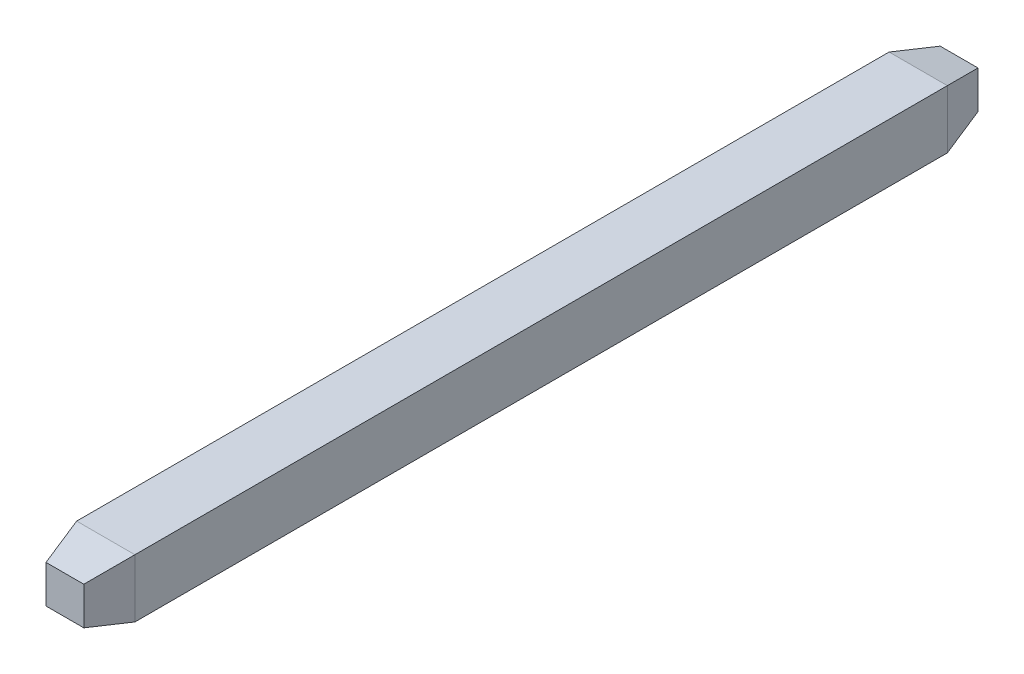
ISO-10303-21;
HEADER;
FILE_DESCRIPTION(('STEP AP214'),'2;1');
FILE_NAME('part.step','',(''),(''),'','','');
FILE_SCHEMA(('AUTOMOTIVE_DESIGN { 1 0 10303 214 1 1 1 1 }'));
ENDSEC;
DATA;
#1=APPLICATION_CONTEXT('core data for automotive mechanical design processes');
#2=APPLICATION_PROTOCOL_DEFINITION('international standard','automotive_design',2000,#1);
#3=PRODUCT_CONTEXT('',#1,'mechanical');
#4=PRODUCT('Part','Part','',(#3));
#5=PRODUCT_RELATED_PRODUCT_CATEGORY('part','',(#4));
#6=PRODUCT_DEFINITION_FORMATION('','',#4);
#7=PRODUCT_DEFINITION_CONTEXT('part definition',#1,'design');
#8=PRODUCT_DEFINITION('design','',#6,#7);
#9=PRODUCT_DEFINITION_SHAPE('','',#8);
#10=(LENGTH_UNIT() NAMED_UNIT(*) SI_UNIT(.MILLI.,.METRE.));
#11=(NAMED_UNIT(*) PLANE_ANGLE_UNIT() SI_UNIT($,.RADIAN.));
#12=(NAMED_UNIT(*) SI_UNIT($,.STERADIAN.) SOLID_ANGLE_UNIT());
#13=UNCERTAINTY_MEASURE_WITH_UNIT(LENGTH_MEASURE(1.E-05),#10,'distance_accuracy_value','');
#14=(GEOMETRIC_REPRESENTATION_CONTEXT(3) GLOBAL_UNCERTAINTY_ASSIGNED_CONTEXT((#13)) GLOBAL_UNIT_ASSIGNED_CONTEXT((#10,
#11,#12)) REPRESENTATION_CONTEXT('',''));
#15=CARTESIAN_POINT('',(0.,0.,0.));
#16=DIRECTION('',(0.,0.,1.));
#17=DIRECTION('',(1.,0.,0.));
#18=AXIS2_PLACEMENT_3D('',#15,#16,#17);
#19=CARTESIAN_POINT('',(0.47,0.,13.5));
#20=DIRECTION('',(0.970142500145391,0.,0.242535625036098));
#21=DIRECTION('',(0.242535625036098,0.,-0.970142500145391));
#22=AXIS2_PLACEMENT_3D('',#19,#20,#21);
#23=PLANE('',#22);
#24=DIRECTION('',(0.,-1.,0.));
#25=VECTOR('',#24,1.);
#26=CARTESIAN_POINT('',(0.37,0.,13.9));
#27=LINE('',#26,#25);
#28=CARTESIAN_POINT('',(0.370000000000048,-0.370000000000024,13.9));
#29=VERTEX_POINT('',#28);
#30=CARTESIAN_POINT('',(0.370000000000024,0.370000000000024,13.9));
#31=VERTEX_POINT('',#30);
#32=EDGE_CURVE('E20',#29,#31,#27,.F.);
#33=ORIENTED_EDGE('',*,*,#32,.F.);
#34=DIRECTION('',(-0.235702260395516,0.235702260395287,0.942809041582121));
#35=VECTOR('',#34,1.);
#36=CARTESIAN_POINT('',(0.57,-0.569999999999903,13.1));
#37=LINE('',#36,#35);
#38=CARTESIAN_POINT('',(0.569999999999951,-0.569999999999976,13.1));
#39=VERTEX_POINT('',#38);
#40=EDGE_CURVE('E110',#39,#29,#37,.T.);
#41=ORIENTED_EDGE('',*,*,#40,.F.);
#42=DIRECTION('',(0.,1.,0.));
#43=VECTOR('',#42,1.);
#44=CARTESIAN_POINT('',(0.57,0.,13.1));
#45=LINE('',#44,#43);
#46=CARTESIAN_POINT('',(0.569999999999951,0.569999999999976,13.1));
#47=VERTEX_POINT('',#46);
#48=EDGE_CURVE('E96',#47,#39,#45,.F.);
#49=ORIENTED_EDGE('',*,*,#48,.F.);
#50=DIRECTION('',(0.235702260395516,0.235702260395287,-0.942809041582121));
#51=VECTOR('',#50,1.);
#52=CARTESIAN_POINT('',(0.37,0.370000000000097,13.9));
#53=LINE('',#52,#51);
#54=EDGE_CURVE('E94',#31,#47,#53,.T.);
#55=ORIENTED_EDGE('',*,*,#54,.F.);
#56=EDGE_LOOP('',(#33,#41,#49,#55));
#57=FACE_BOUND('',#56,.T.);
#58=ADVANCED_FACE('F17',(#57),#23,.T.);
#59=CARTESIAN_POINT('',(0.47,0.,-3.2));
#60=DIRECTION('',(0.970142500145391,0.,-0.242535625036098));
#61=DIRECTION('',(-0.242535625036098,0.,-0.970142500145391));
#62=AXIS2_PLACEMENT_3D('',#59,#60,#61);
#63=PLANE('',#62);
#64=DIRECTION('',(0.,1.,0.));
#65=VECTOR('',#64,1.);
#66=CARTESIAN_POINT('',(0.37,0.,-3.6));
#67=LINE('',#66,#65);
#68=CARTESIAN_POINT('',(0.370000000000024,-0.370000000000024,-3.60000000000001));
#69=VERTEX_POINT('',#68);
#70=CARTESIAN_POINT('',(0.370000000000049,0.370000000000024,-3.60000000000002));
#71=VERTEX_POINT('',#70);
#72=EDGE_CURVE('E79',#69,#71,#67,.T.);
#73=ORIENTED_EDGE('',*,*,#72,.T.);
#74=DIRECTION('',(-0.235702260395516,-0.235702260395287,-0.942809041582121));
#75=VECTOR('',#74,1.);
#76=CARTESIAN_POINT('',(0.57,0.569999999999903,-2.79999999999998));
#77=LINE('',#76,#75);
#78=CARTESIAN_POINT('',(0.569999999999952,0.569999999999988,-2.79999999999998));
#79=VERTEX_POINT('',#78);
#80=EDGE_CURVE('E99',#79,#71,#77,.T.);
#81=ORIENTED_EDGE('',*,*,#80,.F.);
#82=DIRECTION('',(0.,1.,0.));
#83=VECTOR('',#82,1.);
#84=CARTESIAN_POINT('',(0.57,0.,-2.8));
#85=LINE('',#84,#83);
#86=CARTESIAN_POINT('',(0.569999999999952,-0.569999999999976,-2.79999999999998));
#87=VERTEX_POINT('',#86);
#88=EDGE_CURVE('E119',#87,#79,#85,.T.);
#89=ORIENTED_EDGE('',*,*,#88,.F.);
#90=DIRECTION('',(0.235702260395516,-0.235702260395287,0.942809041582121));
#91=VECTOR('',#90,1.);
#92=CARTESIAN_POINT('',(0.37,-0.370000000000097,-3.60000000000002));
#93=LINE('',#92,#91);
#94=EDGE_CURVE('E116',#69,#87,#93,.T.);
#95=ORIENTED_EDGE('',*,*,#94,.F.);
#96=EDGE_LOOP('',(#73,#81,#89,#95));
#97=FACE_BOUND('',#96,.T.);
#98=ADVANCED_FACE('F298',(#97),#63,.T.);
#99=CARTESIAN_POINT('',(0.,0.,13.9));
#100=DIRECTION('',(0.,0.,1.));
#101=DIRECTION('',(0.,-1.,0.));
#102=AXIS2_PLACEMENT_3D('',#99,#100,#101);
#103=PLANE('',#102);
#104=ORIENTED_EDGE('',*,*,#32,.T.);
#105=DIRECTION('',(1.,0.,0.));
#106=VECTOR('',#105,1.);
#107=CARTESIAN_POINT('',(0.,0.370000000000097,13.9));
#108=LINE('',#107,#106);
#109=CARTESIAN_POINT('',(-0.370000000000024,0.370000000000024,13.9));
#110=VERTEX_POINT('',#109);
#111=EDGE_CURVE('E88',#110,#31,#108,.T.);
#112=ORIENTED_EDGE('',*,*,#111,.F.);
#113=DIRECTION('',(0.,1.,0.));
#114=VECTOR('',#113,1.);
#115=CARTESIAN_POINT('',(-0.370000000000097,0.,13.9));
#116=LINE('',#115,#114);
#117=CARTESIAN_POINT('',(-0.370000000000024,-0.370000000000048,13.9));
#118=VERTEX_POINT('',#117);
#119=EDGE_CURVE('E125',#118,#110,#116,.T.);
#120=ORIENTED_EDGE('',*,*,#119,.F.);
#121=DIRECTION('',(1.,0.,0.));
#122=VECTOR('',#121,1.);
#123=CARTESIAN_POINT('',(0.,-0.370000000000097,13.9));
#124=LINE('',#123,#122);
#125=EDGE_CURVE('E90',#29,#118,#124,.F.);
#126=ORIENTED_EDGE('',*,*,#125,.F.);
#127=EDGE_LOOP('',(#104,#112,#120,#126));
#128=FACE_BOUND('',#127,.T.);
#129=ADVANCED_FACE('F85',(#128),#103,.T.);
#130=CARTESIAN_POINT('',(0.,0.47,13.5));
#131=DIRECTION('',(0.,0.970142500145391,0.242535625036098));
#132=DIRECTION('',(0.,-0.242535625036098,0.970142500145391));
#133=AXIS2_PLACEMENT_3D('',#130,#131,#132);
#134=PLANE('',#133);
#135=ORIENTED_EDGE('',*,*,#111,.T.);
#136=ORIENTED_EDGE('',*,*,#54,.T.);
#137=DIRECTION('',(-1.,0.,0.));
#138=VECTOR('',#137,1.);
#139=CARTESIAN_POINT('',(0.,0.57,13.1));
#140=LINE('',#139,#138);
#141=CARTESIAN_POINT('',(-0.569999999999976,0.569999999999951,13.1));
#142=VERTEX_POINT('',#141);
#143=EDGE_CURVE('E128',#142,#47,#140,.F.);
#144=ORIENTED_EDGE('',*,*,#143,.F.);
#145=DIRECTION('',(-0.235702260395287,0.235702260395516,-0.942809041582121));
#146=VECTOR('',#145,1.);
#147=CARTESIAN_POINT('',(-0.370000000000097,0.37,13.9));
#148=LINE('',#147,#146);
#149=EDGE_CURVE('E103',#110,#142,#148,.T.);
#150=ORIENTED_EDGE('',*,*,#149,.F.);
#151=EDGE_LOOP('',(#135,#136,#144,#150));
#152=FACE_BOUND('',#151,.T.);
#153=ADVANCED_FACE('F101',(#152),#134,.T.);
#154=CARTESIAN_POINT('',(0.,0.47,-3.2));
#155=DIRECTION('',(0.,0.970142500145391,-0.242535625036098));
#156=DIRECTION('',(0.,0.242535625036098,0.970142500145391));
#157=AXIS2_PLACEMENT_3D('',#154,#155,#156);
#158=PLANE('',#157);
#159=DIRECTION('',(1.,0.,0.));
#160=VECTOR('',#159,1.);
#161=CARTESIAN_POINT('',(0.,0.37,-3.6));
#162=LINE('',#161,#160);
#163=CARTESIAN_POINT('',(-0.370000000000024,0.370000000000049,-3.60000000000002));
#164=VERTEX_POINT('',#163);
#165=EDGE_CURVE('E108',#71,#164,#162,.F.);
#166=ORIENTED_EDGE('',*,*,#165,.T.);
#167=DIRECTION('',(0.235702260395287,-0.235702260395516,-0.942809041582121));
#168=VECTOR('',#167,1.);
#169=CARTESIAN_POINT('',(-0.569999999999903,0.57,-2.79999999999998));
#170=LINE('',#169,#168);
#171=CARTESIAN_POINT('',(-0.569999999999988,0.569999999999951,-2.79999999999998));
#172=VERTEX_POINT('',#171);
#173=EDGE_CURVE('E137',#172,#164,#170,.T.);
#174=ORIENTED_EDGE('',*,*,#173,.F.);
#175=DIRECTION('',(-1.,0.,0.));
#176=VECTOR('',#175,1.);
#177=CARTESIAN_POINT('',(0.,0.57,-2.8));
#178=LINE('',#177,#176);
#179=EDGE_CURVE('E134',#79,#172,#178,.T.);
#180=ORIENTED_EDGE('',*,*,#179,.F.);
#181=ORIENTED_EDGE('',*,*,#80,.T.);
#182=EDGE_LOOP('',(#166,#174,#180,#181));
#183=FACE_BOUND('',#182,.T.);
#184=ADVANCED_FACE('F271',(#183),#158,.T.);
#185=CARTESIAN_POINT('',(0.,0.,-3.6));
#186=DIRECTION('',(0.,0.,1.));
#187=DIRECTION('',(1.,0.,0.));
#188=AXIS2_PLACEMENT_3D('',#185,#186,#187);
#189=PLANE('',#188);
#190=ORIENTED_EDGE('',*,*,#165,.F.);
#191=ORIENTED_EDGE('',*,*,#72,.F.);
#192=DIRECTION('',(1.,0.,0.));
#193=VECTOR('',#192,1.);
#194=CARTESIAN_POINT('',(0.,-0.370000000000097,-3.60000000000002));
#195=LINE('',#194,#193);
#196=CARTESIAN_POINT('',(-0.370000000000024,-0.370000000000024,-3.60000000000001));
#197=VERTEX_POINT('',#196);
#198=EDGE_CURVE('E113',#197,#69,#195,.T.);
#199=ORIENTED_EDGE('',*,*,#198,.F.);
#200=DIRECTION('',(0.,1.,0.));
#201=VECTOR('',#200,1.);
#202=CARTESIAN_POINT('',(-0.370000000000097,0.,-3.60000000000002));
#203=LINE('',#202,#201);
#204=EDGE_CURVE('E140',#164,#197,#203,.F.);
#205=ORIENTED_EDGE('',*,*,#204,.F.);
#206=EDGE_LOOP('',(#190,#191,#199,#205));
#207=FACE_BOUND('',#206,.T.);
#208=ADVANCED_FACE('F262',(#207),#189,.F.);
#209=CARTESIAN_POINT('',(0.,-0.47,13.5));
#210=DIRECTION('',(0.,-0.970142500145391,0.242535625036098));
#211=DIRECTION('',(0.,-0.242535625036098,-0.970142500145391));
#212=AXIS2_PLACEMENT_3D('',#209,#210,#211);
#213=PLANE('',#212);
#214=ORIENTED_EDGE('',*,*,#125,.T.);
#215=DIRECTION('',(0.235702260395287,0.235702260395516,0.942809041582121));
#216=VECTOR('',#215,1.);
#217=CARTESIAN_POINT('',(-0.569999999999903,-0.57,13.1));
#218=LINE('',#217,#216);
#219=CARTESIAN_POINT('',(-0.569999999999976,-0.569999999999951,13.1));
#220=VERTEX_POINT('',#219);
#221=EDGE_CURVE('E122',#220,#118,#218,.T.);
#222=ORIENTED_EDGE('',*,*,#221,.F.);
#223=DIRECTION('',(1.,0.,0.));
#224=VECTOR('',#223,1.);
#225=CARTESIAN_POINT('',(0.,-0.57,13.1));
#226=LINE('',#225,#224);
#227=EDGE_CURVE('E145',#39,#220,#226,.F.);
#228=ORIENTED_EDGE('',*,*,#227,.F.);
#229=ORIENTED_EDGE('',*,*,#40,.T.);
#230=EDGE_LOOP('',(#214,#222,#228,#229));
#231=FACE_BOUND('',#230,.T.);
#232=ADVANCED_FACE('F172',(#231),#213,.T.);
#233=CARTESIAN_POINT('',(0.,-0.47,-3.2));
#234=DIRECTION('',(0.,-0.970142500145391,-0.242535625036098));
#235=DIRECTION('',(0.,0.242535625036098,-0.970142500145391));
#236=AXIS2_PLACEMENT_3D('',#233,#234,#235);
#237=PLANE('',#236);
#238=ORIENTED_EDGE('',*,*,#198,.T.);
#239=ORIENTED_EDGE('',*,*,#94,.T.);
#240=DIRECTION('',(1.,0.,0.));
#241=VECTOR('',#240,1.);
#242=CARTESIAN_POINT('',(0.,-0.57,-2.8));
#243=LINE('',#242,#241);
#244=CARTESIAN_POINT('',(-0.569999999999976,-0.569999999999952,-2.79999999999998));
#245=VERTEX_POINT('',#244);
#246=EDGE_CURVE('E35',#245,#87,#243,.T.);
#247=ORIENTED_EDGE('',*,*,#246,.F.);
#248=DIRECTION('',(-0.235702260395287,-0.235702260395516,0.942809041582121));
#249=VECTOR('',#248,1.);
#250=CARTESIAN_POINT('',(-0.370000000000097,-0.37,-3.60000000000002));
#251=LINE('',#250,#249);
#252=EDGE_CURVE('E143',#197,#245,#251,.T.);
#253=ORIENTED_EDGE('',*,*,#252,.F.);
#254=EDGE_LOOP('',(#238,#239,#247,#253));
#255=FACE_BOUND('',#254,.T.);
#256=ADVANCED_FACE('F189',(#255),#237,.T.);
#257=CARTESIAN_POINT('',(0.57,0.,0.));
#258=DIRECTION('',(1.,0.,0.));
#259=DIRECTION('',(0.,0.,-1.));
#260=AXIS2_PLACEMENT_3D('',#257,#258,#259);
#261=PLANE('',#260);
#262=ORIENTED_EDGE('',*,*,#88,.T.);
#263=DIRECTION('',(0.,0.,1.));
#264=VECTOR('',#263,1.);
#265=CARTESIAN_POINT('',(0.57,0.57,0.));
#266=LINE('',#265,#264);
#267=EDGE_CURVE('E131',#47,#79,#266,.F.);
#268=ORIENTED_EDGE('',*,*,#267,.F.);
#269=ORIENTED_EDGE('',*,*,#48,.T.);
#270=DIRECTION('',(0.,0.,1.));
#271=VECTOR('',#270,1.);
#272=CARTESIAN_POINT('',(0.57,-0.57,0.));
#273=LINE('',#272,#271);
#274=EDGE_CURVE('E149',#87,#39,#273,.T.);
#275=ORIENTED_EDGE('',*,*,#274,.F.);
#276=EDGE_LOOP('',(#262,#268,#269,#275));
#277=FACE_BOUND('',#276,.T.);
#278=ADVANCED_FACE('F175',(#277),#261,.T.);
#279=CARTESIAN_POINT('',(-0.47,0.,13.5));
#280=DIRECTION('',(-0.970142500145391,0.,0.242535625036098));
#281=DIRECTION('',(0.242535625036098,0.,0.970142500145391));
#282=AXIS2_PLACEMENT_3D('',#279,#280,#281);
#283=PLANE('',#282);
#284=ORIENTED_EDGE('',*,*,#119,.T.);
#285=ORIENTED_EDGE('',*,*,#149,.T.);
#286=DIRECTION('',(0.,1.,0.));
#287=VECTOR('',#286,1.);
#288=CARTESIAN_POINT('',(-0.57,0.,13.1));
#289=LINE('',#288,#287);
#290=EDGE_CURVE('E152',#220,#142,#289,.T.);
#291=ORIENTED_EDGE('',*,*,#290,.F.);
#292=ORIENTED_EDGE('',*,*,#221,.T.);
#293=EDGE_LOOP('',(#284,#285,#291,#292));
#294=FACE_BOUND('',#293,.T.);
#295=ADVANCED_FACE('F180',(#294),#283,.T.);
#296=CARTESIAN_POINT('',(0.,0.57,0.));
#297=DIRECTION('',(0.,1.,0.));
#298=DIRECTION('',(-1.,0.,0.));
#299=AXIS2_PLACEMENT_3D('',#296,#297,#298);
#300=PLANE('',#299);
#301=ORIENTED_EDGE('',*,*,#179,.T.);
#302=DIRECTION('',(0.,0.,1.));
#303=VECTOR('',#302,1.);
#304=CARTESIAN_POINT('',(-0.57,0.57,0.));
#305=LINE('',#304,#303);
#306=EDGE_CURVE('E155',#142,#172,#305,.F.);
#307=ORIENTED_EDGE('',*,*,#306,.F.);
#308=ORIENTED_EDGE('',*,*,#143,.T.);
#309=ORIENTED_EDGE('',*,*,#267,.T.);
#310=EDGE_LOOP('',(#301,#307,#308,#309));
#311=FACE_BOUND('',#310,.T.);
#312=ADVANCED_FACE('F178',(#311),#300,.T.);
#313=CARTESIAN_POINT('',(-0.47,0.,-3.2));
#314=DIRECTION('',(-0.970142500145391,0.,-0.242535625036098));
#315=DIRECTION('',(-0.242535625036098,0.,0.970142500145391));
#316=AXIS2_PLACEMENT_3D('',#313,#314,#315);
#317=PLANE('',#316);
#318=ORIENTED_EDGE('',*,*,#204,.T.);
#319=ORIENTED_EDGE('',*,*,#252,.T.);
#320=DIRECTION('',(0.,1.,0.));
#321=VECTOR('',#320,1.);
#322=CARTESIAN_POINT('',(-0.57,0.,-2.8));
#323=LINE('',#322,#321);
#324=EDGE_CURVE('E26',#172,#245,#323,.F.);
#325=ORIENTED_EDGE('',*,*,#324,.F.);
#326=ORIENTED_EDGE('',*,*,#173,.T.);
#327=EDGE_LOOP('',(#318,#319,#325,#326));
#328=FACE_BOUND('',#327,.T.);
#329=ADVANCED_FACE('F165',(#328),#317,.T.);
#330=CARTESIAN_POINT('',(0.,-0.57,0.));
#331=DIRECTION('',(0.,-1.,0.));
#332=DIRECTION('',(1.,0.,0.));
#333=AXIS2_PLACEMENT_3D('',#330,#331,#332);
#334=PLANE('',#333);
#335=ORIENTED_EDGE('',*,*,#246,.T.);
#336=ORIENTED_EDGE('',*,*,#274,.T.);
#337=ORIENTED_EDGE('',*,*,#227,.T.);
#338=DIRECTION('',(0.,0.,1.));
#339=VECTOR('',#338,1.);
#340=CARTESIAN_POINT('',(-0.57,-0.57,0.));
#341=LINE('',#340,#339);
#342=EDGE_CURVE('E11',#245,#220,#341,.T.);
#343=ORIENTED_EDGE('',*,*,#342,.F.);
#344=EDGE_LOOP('',(#335,#336,#337,#343));
#345=FACE_BOUND('',#344,.T.);
#346=ADVANCED_FACE('F168',(#345),#334,.T.);
#347=CARTESIAN_POINT('',(-0.57,0.,0.));
#348=DIRECTION('',(-1.,0.,0.));
#349=DIRECTION('',(0.,0.,1.));
#350=AXIS2_PLACEMENT_3D('',#347,#348,#349);
#351=PLANE('',#350);
#352=ORIENTED_EDGE('',*,*,#324,.T.);
#353=ORIENTED_EDGE('',*,*,#342,.T.);
#354=ORIENTED_EDGE('',*,*,#290,.T.);
#355=ORIENTED_EDGE('',*,*,#306,.T.);
#356=EDGE_LOOP('',(#352,#353,#354,#355));
#357=FACE_BOUND('',#356,.T.);
#358=ADVANCED_FACE('F161',(#357),#351,.T.);
#359=CLOSED_SHELL('',(#58,#98,#129,#153,#184,#208,#232,#256,#278,#295,#312,#329,#346,#358));
#360=MANIFOLD_SOLID_BREP('B1',#359);
#361=ADVANCED_BREP_SHAPE_REPRESENTATION('',(#18,#360),#14);
#362=SHAPE_DEFINITION_REPRESENTATION(#9,#361);
ENDSEC;
END-ISO-10303-21;
